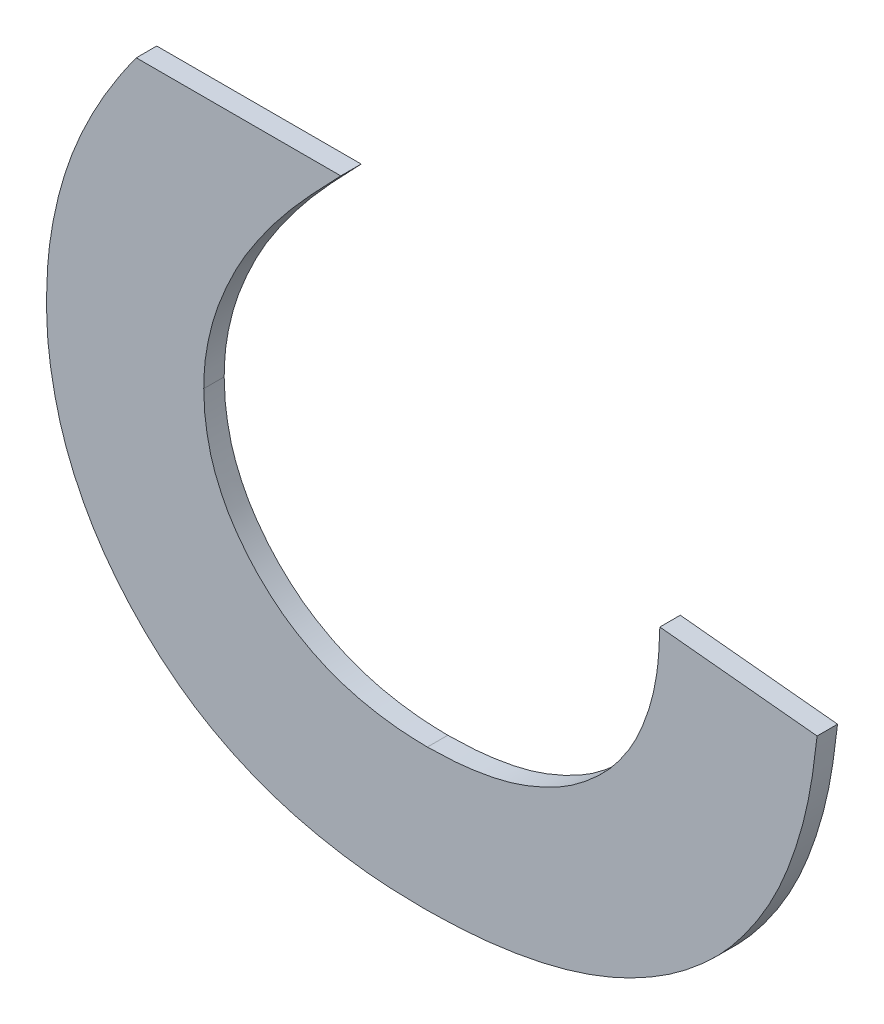
ISO-10303-21;
HEADER;
FILE_DESCRIPTION(('STEP AP214'),'2;1');
FILE_NAME('part.step','',(''),(''),'','','');
FILE_SCHEMA(('AUTOMOTIVE_DESIGN { 1 0 10303 214 1 1 1 1 }'));
ENDSEC;
DATA;
#1=APPLICATION_CONTEXT('core data for automotive mechanical design processes');
#2=APPLICATION_PROTOCOL_DEFINITION('international standard','automotive_design',2000,#1);
#3=PRODUCT_CONTEXT('',#1,'mechanical');
#4=PRODUCT('Part','Part','',(#3));
#5=PRODUCT_RELATED_PRODUCT_CATEGORY('part','',(#4));
#6=PRODUCT_DEFINITION_FORMATION('','',#4);
#7=PRODUCT_DEFINITION_CONTEXT('part definition',#1,'design');
#8=PRODUCT_DEFINITION('design','',#6,#7);
#9=PRODUCT_DEFINITION_SHAPE('','',#8);
#10=(LENGTH_UNIT() NAMED_UNIT(*) SI_UNIT(.MILLI.,.METRE.));
#11=(NAMED_UNIT(*) PLANE_ANGLE_UNIT() SI_UNIT($,.RADIAN.));
#12=(NAMED_UNIT(*) SI_UNIT($,.STERADIAN.) SOLID_ANGLE_UNIT());
#13=UNCERTAINTY_MEASURE_WITH_UNIT(LENGTH_MEASURE(1.E-05),#10,'distance_accuracy_value','');
#14=(GEOMETRIC_REPRESENTATION_CONTEXT(3) GLOBAL_UNCERTAINTY_ASSIGNED_CONTEXT((#13)) GLOBAL_UNIT_ASSIGNED_CONTEXT((#10,
#11,#12)) REPRESENTATION_CONTEXT('',''));
#15=CARTESIAN_POINT('',(0.,0.,0.));
#16=DIRECTION('',(0.,0.,1.));
#17=DIRECTION('',(1.,0.,0.));
#18=AXIS2_PLACEMENT_3D('',#15,#16,#17);
#19=CARTESIAN_POINT('',(0.384615384614354,-15.,0.5));
#20=CARTESIAN_POINT('',(0.0377099923203697,-14.9940575811924,0.5));
#21=CARTESIAN_POINT('',(-0.638063755181499,-14.9824817143538,0.5));
#22=CARTESIAN_POINT('',(-1.62279290019803,-14.8641061896539,0.5));
#23=CARTESIAN_POINT('',(-2.55184417902887,-14.6795931344762,0.5));
#24=CARTESIAN_POINT('',(-3.42893590532352,-14.4229332630746,0.5));
#25=CARTESIAN_POINT('',(-4.24940902985222,-14.083966549589,0.5));
#26=CARTESIAN_POINT('',(-5.01606953500129,-13.6757110311212,0.5));
#27=CARTESIAN_POINT('',(-5.72650139366369,-13.1911539647884,0.5));
#28=CARTESIAN_POINT('',(-6.37101761670645,-12.6323956716173,0.5));
#29=CARTESIAN_POINT('',(-6.95235611217082,-12.0221972437031,0.5));
#30=CARTESIAN_POINT('',(-7.46063357913813,-11.3704699091198,0.5));
#31=CARTESIAN_POINT('',(-7.89045869700782,-10.6818974458787,0.5));
#32=CARTESIAN_POINT('',(-8.23921152866284,-9.95800141103973,0.5));
#33=CARTESIAN_POINT('',(-8.51448917012395,-9.19941421301716,0.5));
#34=CARTESIAN_POINT('',(-8.70121922472878,-8.40443010163868,0.5));
#35=CARTESIAN_POINT('',(-8.83023093254306,-7.57430332658602,0.5));
#36=CARTESIAN_POINT('',(-8.8407756459225,-7.00772582515545,0.5));
#37=CARTESIAN_POINT('',(-8.84615384615488,-6.71875,0.5));
#38=B_SPLINE_CURVE_WITH_KNOTS('',3,(#19,#20,#21,#22,#23,#24,#25,#26,#27,#28,#29,#30,#31,#32,#33,
#34,#35,#36,#37),.UNSPECIFIED.,.F.,.F.,(4,1,1,1,1,1,1,1,1,1,1,1,1,1,1,1,4),(0.,
0.0746990601627185,0.145514209183145,0.213302420909138,0.278567227460936,0.342035449705525,
0.404200807806776,0.465363579233685,0.52686639946622,0.587607564346274,0.646649545103447,
0.704604443573224,0.76211908002101,0.819448870100961,0.878060343861484,0.937806191275107,1.),.UNSPECIFIED.);
#39=DIRECTION('',(0.,0.,1.));
#40=VECTOR('',#39,1.);
#41=SURFACE_OF_LINEAR_EXTRUSION('',#38,#40);
#42=CARTESIAN_POINT('',(0.384615384614354,-15.,1.));
#43=CARTESIAN_POINT('',(0.0377099923203697,-14.9940575811924,1.));
#44=CARTESIAN_POINT('',(-0.638063755181499,-14.9824817143538,1.));
#45=CARTESIAN_POINT('',(-1.62279290019803,-14.8641061896539,1.));
#46=CARTESIAN_POINT('',(-2.55184417902887,-14.6795931344762,1.));
#47=CARTESIAN_POINT('',(-3.42893590532352,-14.4229332630746,1.));
#48=CARTESIAN_POINT('',(-4.24940902985222,-14.083966549589,1.));
#49=CARTESIAN_POINT('',(-5.01606953500129,-13.6757110311212,1.));
#50=CARTESIAN_POINT('',(-5.72650139366369,-13.1911539647884,1.));
#51=CARTESIAN_POINT('',(-6.37101761670645,-12.6323956716173,1.));
#52=CARTESIAN_POINT('',(-6.95235611217082,-12.0221972437031,1.));
#53=CARTESIAN_POINT('',(-7.46063357913813,-11.3704699091198,1.));
#54=CARTESIAN_POINT('',(-7.89045869700782,-10.6818974458787,1.));
#55=CARTESIAN_POINT('',(-8.23921152866284,-9.95800141103973,1.));
#56=CARTESIAN_POINT('',(-8.51448917012395,-9.19941421301716,1.));
#57=CARTESIAN_POINT('',(-8.70121922472878,-8.40443010163868,1.));
#58=CARTESIAN_POINT('',(-8.83023093254306,-7.57430332658602,1.));
#59=CARTESIAN_POINT('',(-8.8407756459225,-7.00772582515545,1.));
#60=CARTESIAN_POINT('',(-8.84615384615488,-6.71875,1.));
#61=B_SPLINE_CURVE_WITH_KNOTS('',3,(#42,#43,#44,#45,#46,#47,#48,#49,#50,#51,#52,#53,#54,#55,#56,
#57,#58,#59,#60),.UNSPECIFIED.,.F.,.F.,(4,1,1,1,1,1,1,1,1,1,1,1,1,1,1,1,4),(0.,
0.0746990601627185,0.145514209183145,0.213302420909138,0.278567227460936,0.342035449705525,
0.404200807806776,0.465363579233685,0.52686639946622,0.587607564346274,0.646649545103447,
0.704604443573224,0.76211908002101,0.819448870100961,0.878060343861484,0.937806191275107,1.),.UNSPECIFIED.);
#62=CARTESIAN_POINT('',(0.384615384614354,-15.,1.));
#63=VERTEX_POINT('',#62);
#64=CARTESIAN_POINT('',(-8.84615384615488,-6.71875,1.));
#65=VERTEX_POINT('',#64);
#66=EDGE_CURVE('E95',#63,#65,#61,.T.);
#67=ORIENTED_EDGE('',*,*,#66,.T.);
#68=DIRECTION('',(0.,0.,1.));
#69=VECTOR('',#68,1.);
#70=CARTESIAN_POINT('',(-8.84615384615488,-6.71875,0.5));
#71=LINE('',#70,#69);
#72=CARTESIAN_POINT('',(-8.84615384615488,-6.71875,0.5));
#73=VERTEX_POINT('',#72);
#74=EDGE_CURVE('E201',#73,#65,#71,.T.);
#75=ORIENTED_EDGE('',*,*,#74,.F.);
#76=CARTESIAN_POINT('',(0.384615384614354,-15.,0.5));
#77=VERTEX_POINT('',#76);
#78=EDGE_CURVE('E63',#77,#73,#38,.T.);
#79=ORIENTED_EDGE('',*,*,#78,.F.);
#80=DIRECTION('',(0.,0.,1.));
#81=VECTOR('',#80,1.);
#82=CARTESIAN_POINT('',(0.384615384614354,-15.,0.5));
#83=LINE('',#82,#81);
#84=EDGE_CURVE('E129',#77,#63,#83,.T.);
#85=ORIENTED_EDGE('',*,*,#84,.T.);
#86=EDGE_LOOP('',(#67,#75,#79,#85));
#87=FACE_BOUND('',#86,.T.);
#88=ADVANCED_FACE('F39',(#87),#41,.F.);
#89=CARTESIAN_POINT('',(9.99999999999897,-6.53846153846153,0.5));
#90=CARTESIAN_POINT('',(9.9606531223146,-6.87366666840529,0.5));
#91=CARTESIAN_POINT('',(9.88410715849025,-7.52577939654185,0.5));
#92=CARTESIAN_POINT('',(9.69335328704841,-8.47019798415294,0.5));
#93=CARTESIAN_POINT('',(9.42587604861149,-9.34898964498448,0.5));
#94=CARTESIAN_POINT('',(9.10472020560015,-10.1734299417282,0.5));
#95=CARTESIAN_POINT('',(8.70555868574364,-10.9339168637297,0.5));
#96=CARTESIAN_POINT('',(8.2401623736781,-11.632770632999,0.5));
#97=CARTESIAN_POINT('',(7.71747521493515,-12.2780099671338,0.5));
#98=CARTESIAN_POINT('',(7.11838539032061,-12.8459189293064,0.5));
#99=CARTESIAN_POINT('',(6.46617765777263,-13.356498648467,0.5));
#100=CARTESIAN_POINT('',(5.75439663858905,-13.7929185063039,0.5));
#101=CARTESIAN_POINT('',(4.99092026255268,-14.1697671525304,0.5));
#102=CARTESIAN_POINT('',(4.17339618076206,-14.4749707596549,0.5));
#103=CARTESIAN_POINT('',(3.30158648148104,-14.7086947396734,0.5));
#104=CARTESIAN_POINT('',(2.37700536496708,-14.8758437040908,0.5));
#105=CARTESIAN_POINT('',(1.39856215501955,-14.9789919083148,0.5));
#106=CARTESIAN_POINT('',(0.727420084521651,-14.9928973859615,0.5));
#107=CARTESIAN_POINT('',(0.384615384614354,-15.,0.5));
#108=B_SPLINE_CURVE_WITH_KNOTS('',3,(#89,#90,#91,#92,#93,#94,#95,#96,#97,#98,#99,#100,#101,#102,
#103,#104,#105,#106,#107),.UNSPECIFIED.,.F.,.F.,(4,1,1,1,1,1,1,1,1,1,1,1,1,1,1,1,4),(0.,
0.0706767817247823,0.13749559547073,0.201477077226668,0.262874869329738,0.322556893578126,
0.380976286457824,0.438515087155202,0.496086006375959,0.553494619961452,0.611714772909301,
0.670636788125626,0.731581283871167,0.79417885027081,0.859442145684026,0.928206120303776,1.),.UNSPECIFIED.);
#109=DIRECTION('',(0.,0.,1.));
#110=VECTOR('',#109,1.);
#111=SURFACE_OF_LINEAR_EXTRUSION('',#108,#110);
#112=CARTESIAN_POINT('',(9.99999999999897,-6.53846153846153,1.));
#113=CARTESIAN_POINT('',(9.9606531223146,-6.87366666840529,1.));
#114=CARTESIAN_POINT('',(9.88410715849025,-7.52577939654185,1.));
#115=CARTESIAN_POINT('',(9.69335328704841,-8.47019798415294,1.));
#116=CARTESIAN_POINT('',(9.42587604861149,-9.34898964498448,1.));
#117=CARTESIAN_POINT('',(9.10472020560015,-10.1734299417282,1.));
#118=CARTESIAN_POINT('',(8.70555868574364,-10.9339168637297,1.));
#119=CARTESIAN_POINT('',(8.2401623736781,-11.632770632999,1.));
#120=CARTESIAN_POINT('',(7.71747521493515,-12.2780099671338,1.));
#121=CARTESIAN_POINT('',(7.11838539032061,-12.8459189293064,1.));
#122=CARTESIAN_POINT('',(6.46617765777263,-13.356498648467,1.));
#123=CARTESIAN_POINT('',(5.75439663858905,-13.7929185063039,1.));
#124=CARTESIAN_POINT('',(4.99092026255268,-14.1697671525304,1.));
#125=CARTESIAN_POINT('',(4.17339618076206,-14.4749707596549,1.));
#126=CARTESIAN_POINT('',(3.30158648148104,-14.7086947396734,1.));
#127=CARTESIAN_POINT('',(2.37700536496708,-14.8758437040908,1.));
#128=CARTESIAN_POINT('',(1.39856215501955,-14.9789919083148,1.));
#129=CARTESIAN_POINT('',(0.727420084521651,-14.9928973859615,1.));
#130=CARTESIAN_POINT('',(0.384615384614354,-15.,1.));
#131=B_SPLINE_CURVE_WITH_KNOTS('',3,(#112,#113,#114,#115,#116,#117,#118,#119,#120,#121,#122,
#123,#124,#125,#126,#127,#128,#129,#130),.UNSPECIFIED.,.F.,.F.,(4,1,1,1,1,1,1,1,1,1,1,1,1,1,1,1,
4),(0.,0.0706767817247823,0.13749559547073,0.201477077226668,0.262874869329738,
0.322556893578126,0.380976286457824,0.438515087155202,0.496086006375959,0.553494619961452,
0.611714772909301,0.670636788125626,0.731581283871167,0.79417885027081,0.859442145684026,
0.928206120303776,1.),.UNSPECIFIED.);
#132=CARTESIAN_POINT('',(9.99999999999897,-6.53846153846153,1.));
#133=VERTEX_POINT('',#132);
#134=EDGE_CURVE('E214',#133,#63,#131,.T.);
#135=ORIENTED_EDGE('',*,*,#134,.T.);
#136=ORIENTED_EDGE('',*,*,#84,.F.);
#137=CARTESIAN_POINT('',(9.99999999999897,-6.53846153846153,0.5));
#138=VERTEX_POINT('',#137);
#139=EDGE_CURVE('E111',#138,#77,#108,.T.);
#140=ORIENTED_EDGE('',*,*,#139,.F.);
#141=DIRECTION('',(0.,0.,1.));
#142=VECTOR('',#141,1.);
#143=CARTESIAN_POINT('',(9.99999999999897,-6.53846153846153,0.5));
#144=LINE('',#143,#142);
#145=EDGE_CURVE('E122',#138,#133,#144,.T.);
#146=ORIENTED_EDGE('',*,*,#145,.T.);
#147=EDGE_LOOP('',(#135,#136,#140,#146));
#148=FACE_BOUND('',#147,.T.);
#149=ADVANCED_FACE('F131',(#148),#111,.F.);
#150=CARTESIAN_POINT('',(6.15384615384512,-6.15384615384615,0.5));
#151=DIRECTION('',(-0.0995037190209984,-0.995037190209989,0.));
#152=DIRECTION('',(0.995037190209989,-0.0995037190209984,0.));
#153=AXIS2_PLACEMENT_3D('',#150,#151,#152);
#154=PLANE('',#153);
#155=DIRECTION('',(0.995037190209989,-0.0995037190209984,0.));
#156=VECTOR('',#155,1.);
#157=CARTESIAN_POINT('',(6.15384615384512,-6.15384615384615,1.));
#158=LINE('',#157,#156);
#159=CARTESIAN_POINT('',(6.15384615384512,-6.15384615384615,1.));
#160=VERTEX_POINT('',#159);
#161=EDGE_CURVE('E124',#160,#133,#158,.T.);
#162=ORIENTED_EDGE('',*,*,#161,.T.);
#163=ORIENTED_EDGE('',*,*,#145,.F.);
#164=DIRECTION('',(0.995037190209989,-0.0995037190209984,0.));
#165=VECTOR('',#164,1.);
#166=CARTESIAN_POINT('',(6.15384615384512,-6.15384615384615,0.5));
#167=LINE('',#166,#165);
#168=CARTESIAN_POINT('',(6.15384615384512,-6.15384615384615,0.5));
#169=VERTEX_POINT('',#168);
#170=EDGE_CURVE('E106',#169,#138,#167,.T.);
#171=ORIENTED_EDGE('',*,*,#170,.F.);
#172=DIRECTION('',(0.,0.,1.));
#173=VECTOR('',#172,1.);
#174=CARTESIAN_POINT('',(6.15384615384512,-6.15384615384615,0.5));
#175=LINE('',#174,#173);
#176=EDGE_CURVE('E126',#169,#160,#175,.T.);
#177=ORIENTED_EDGE('',*,*,#176,.T.);
#178=EDGE_LOOP('',(#162,#163,#171,#177));
#179=FACE_BOUND('',#178,.T.);
#180=ADVANCED_FACE('F121',(#179),#154,.F.);
#181=CARTESIAN_POINT('',(0.468749999998968,-11.5384615384615,0.5));
#182=CARTESIAN_POINT('',(0.677274544310018,-11.5336603906601,0.5));
#183=CARTESIAN_POINT('',(1.08537240145137,-11.5242641915888,0.5));
#184=CARTESIAN_POINT('',(1.681997517647,-11.456209318274,0.5));
#185=CARTESIAN_POINT('',(2.24803156178736,-11.3513662812996,0.5));
#186=CARTESIAN_POINT('',(2.78198636072369,-11.1946657306854,0.5));
#187=CARTESIAN_POINT('',(3.28004385609177,-10.9868231443911,0.5));
#188=CARTESIAN_POINT('',(3.75352850677287,-10.7499531539193,0.5));
#189=CARTESIAN_POINT('',(4.18986887918957,-10.4573496219582,0.5));
#190=CARTESIAN_POINT('',(4.58957400719753,-10.1200275486948,0.5));
#191=CARTESIAN_POINT('',(4.95954575386957,-9.75182787501361,0.5));
#192=CARTESIAN_POINT('',(5.27187169797974,-9.33558576426215,0.5));
#193=CARTESIAN_POINT('',(5.54699450538078,-8.89207750793756,0.5));
#194=CARTESIAN_POINT('',(5.75931642131433,-8.40599984356216,0.5));
#195=CARTESIAN_POINT('',(5.93684491213576,-7.89254587961411,0.5));
#196=CARTESIAN_POINT('',(6.06339123334365,-7.34290478555274,0.5));
#197=CARTESIAN_POINT('',(6.13282617100428,-6.7585653684943,0.5));
#198=CARTESIAN_POINT('',(6.14673779765643,-6.35834487320356,0.5));
#199=CARTESIAN_POINT('',(6.15384615384512,-6.15384615384615,0.5));
#200=B_SPLINE_CURVE_WITH_KNOTS('',3,(#181,#182,#183,#184,#185,#186,#187,#188,#189,#190,#191,
#192,#193,#194,#195,#196,#197,#198,#199),.UNSPECIFIED.,.F.,.F.,(4,1,1,1,1,1,1,1,1,1,1,1,1,1,1,1,
4),(0.,0.070687998210276,0.13834160717404,0.203345459401484,0.265668323470064,0.326587550158278,
0.386124288092698,0.4448968030792,0.504204530317891,0.563278454830756,0.621419667782722,
0.680243178453427,0.739826387115308,0.80082507123057,0.864255755827822,0.930639423967569,1.),.UNSPECIFIED.);
#201=DIRECTION('',(0.,0.,1.));
#202=VECTOR('',#201,1.);
#203=SURFACE_OF_LINEAR_EXTRUSION('',#200,#202);
#204=CARTESIAN_POINT('',(0.468749999998968,-11.5384615384615,1.));
#205=CARTESIAN_POINT('',(0.677274544310018,-11.5336603906601,1.));
#206=CARTESIAN_POINT('',(1.08537240145137,-11.5242641915888,1.));
#207=CARTESIAN_POINT('',(1.681997517647,-11.456209318274,1.));
#208=CARTESIAN_POINT('',(2.24803156178736,-11.3513662812996,1.));
#209=CARTESIAN_POINT('',(2.78198636072369,-11.1946657306854,1.));
#210=CARTESIAN_POINT('',(3.28004385609177,-10.9868231443911,1.));
#211=CARTESIAN_POINT('',(3.75352850677287,-10.7499531539193,1.));
#212=CARTESIAN_POINT('',(4.18986887918957,-10.4573496219582,1.));
#213=CARTESIAN_POINT('',(4.58957400719753,-10.1200275486948,1.));
#214=CARTESIAN_POINT('',(4.95954575386957,-9.75182787501361,1.));
#215=CARTESIAN_POINT('',(5.27187169797974,-9.33558576426215,1.));
#216=CARTESIAN_POINT('',(5.54699450538078,-8.89207750793756,1.));
#217=CARTESIAN_POINT('',(5.75931642131433,-8.40599984356216,1.));
#218=CARTESIAN_POINT('',(5.93684491213576,-7.89254587961411,1.));
#219=CARTESIAN_POINT('',(6.06339123334365,-7.34290478555274,1.));
#220=CARTESIAN_POINT('',(6.13282617100428,-6.7585653684943,1.));
#221=CARTESIAN_POINT('',(6.14673779765643,-6.35834487320356,1.));
#222=CARTESIAN_POINT('',(6.15384615384512,-6.15384615384615,1.));
#223=B_SPLINE_CURVE_WITH_KNOTS('',3,(#204,#205,#206,#207,#208,#209,#210,#211,#212,#213,#214,
#215,#216,#217,#218,#219,#220,#221,#222),.UNSPECIFIED.,.F.,.F.,(4,1,1,1,1,1,1,1,1,1,1,1,1,1,1,1,
4),(0.,0.070687998210276,0.13834160717404,0.203345459401484,0.265668323470064,0.326587550158278,
0.386124288092698,0.4448968030792,0.504204530317891,0.563278454830756,0.621419667782722,
0.680243178453427,0.739826387115308,0.80082507123057,0.864255755827822,0.930639423967569,1.),.UNSPECIFIED.);
#224=CARTESIAN_POINT('',(0.468749999998968,-11.5384615384615,1.));
#225=VERTEX_POINT('',#224);
#226=EDGE_CURVE('E196',#225,#160,#223,.T.);
#227=ORIENTED_EDGE('',*,*,#226,.T.);
#228=ORIENTED_EDGE('',*,*,#176,.F.);
#229=CARTESIAN_POINT('',(0.468749999998968,-11.5384615384615,0.5));
#230=VERTEX_POINT('',#229);
#231=EDGE_CURVE('E117',#230,#169,#200,.T.);
#232=ORIENTED_EDGE('',*,*,#231,.F.);
#233=DIRECTION('',(0.,0.,1.));
#234=VECTOR('',#233,1.);
#235=CARTESIAN_POINT('',(0.468749999998968,-11.5384615384615,0.5));
#236=LINE('',#235,#234);
#237=EDGE_CURVE('E191',#230,#225,#236,.T.);
#238=ORIENTED_EDGE('',*,*,#237,.T.);
#239=EDGE_LOOP('',(#227,#228,#232,#238));
#240=FACE_BOUND('',#239,.T.);
#241=ADVANCED_FACE('F155',(#240),#203,.F.);
#242=CARTESIAN_POINT('',(-5.00000000000103,-6.68269230769231,0.5));
#243=CARTESIAN_POINT('',(-4.99582449105417,-6.85129465499825,0.5));
#244=CARTESIAN_POINT('',(-4.98763236958483,-7.18208329099997,0.5));
#245=CARTESIAN_POINT('',(-4.90988978219264,-7.66618368219245,0.5));
#246=CARTESIAN_POINT('',(-4.80170129301121,-8.13240983725261,0.5));
#247=CARTESIAN_POINT('',(-4.62665747476758,-8.57224694930745,0.5));
#248=CARTESIAN_POINT('',(-4.41876954194618,-8.99917721717018,0.5));
#249=CARTESIAN_POINT('',(-4.14941442600319,-9.39928908136599,0.5));
#250=CARTESIAN_POINT('',(-3.84452652281138,-9.78770738474634,0.5));
#251=CARTESIAN_POINT('',(-3.48834372447023,-10.1440891801716,0.5));
#252=CARTESIAN_POINT('',(-3.10201949366179,-10.4780914042811,0.5));
#253=CARTESIAN_POINT('',(-2.67202165526954,-10.7571949576634,0.5));
#254=CARTESIAN_POINT('',(-2.21856517012899,-11.0007504350331,0.5));
#255=CARTESIAN_POINT('',(-1.73771318359313,-11.1992679769149,0.5));
#256=CARTESIAN_POINT('',(-1.22584791928441,-11.3502784661734,0.5));
#257=CARTESIAN_POINT('',(-0.686567618552671,-11.456062625859,0.5));
#258=CARTESIAN_POINT('',(-0.117905563004937,-11.5242979497859,0.5));
#259=CARTESIAN_POINT('',(0.270233276738403,-11.5336687615907,0.5));
#260=CARTESIAN_POINT('',(0.468749999998968,-11.5384615384615,0.5));
#261=B_SPLINE_CURVE_WITH_KNOTS('',3,(#242,#243,#244,#245,#246,#247,#248,#249,#250,#251,#252,
#253,#254,#255,#256,#257,#258,#259,#260),.UNSPECIFIED.,.F.,.F.,(4,1,1,1,1,1,1,1,1,1,1,1,1,1,1,1,
4),(0.,0.0617499482833056,0.121150040270477,0.179385940714247,0.236796617964866,
0.294263617018352,0.353121147770017,0.413211620646579,0.475000848683269,0.537523080949876,
0.600045313216484,0.662459655441933,0.726004070679534,0.790357894134783,0.857752424497621,
0.927246336390439,1.),.UNSPECIFIED.);
#262=DIRECTION('',(0.,0.,1.));
#263=VECTOR('',#262,1.);
#264=SURFACE_OF_LINEAR_EXTRUSION('',#261,#263);
#265=CARTESIAN_POINT('',(-5.00000000000103,-6.68269230769231,1.));
#266=CARTESIAN_POINT('',(-4.99582449105417,-6.85129465499825,1.));
#267=CARTESIAN_POINT('',(-4.98763236958483,-7.18208329099997,1.));
#268=CARTESIAN_POINT('',(-4.90988978219264,-7.66618368219245,1.));
#269=CARTESIAN_POINT('',(-4.80170129301121,-8.13240983725261,1.));
#270=CARTESIAN_POINT('',(-4.62665747476758,-8.57224694930745,1.));
#271=CARTESIAN_POINT('',(-4.41876954194618,-8.99917721717018,1.));
#272=CARTESIAN_POINT('',(-4.14941442600319,-9.39928908136599,1.));
#273=CARTESIAN_POINT('',(-3.84452652281138,-9.78770738474634,1.));
#274=CARTESIAN_POINT('',(-3.48834372447023,-10.1440891801716,1.));
#275=CARTESIAN_POINT('',(-3.10201949366179,-10.4780914042811,1.));
#276=CARTESIAN_POINT('',(-2.67202165526954,-10.7571949576634,1.));
#277=CARTESIAN_POINT('',(-2.21856517012899,-11.0007504350331,1.));
#278=CARTESIAN_POINT('',(-1.73771318359313,-11.1992679769149,1.));
#279=CARTESIAN_POINT('',(-1.22584791928441,-11.3502784661734,1.));
#280=CARTESIAN_POINT('',(-0.686567618552671,-11.456062625859,1.));
#281=CARTESIAN_POINT('',(-0.117905563004937,-11.5242979497859,1.));
#282=CARTESIAN_POINT('',(0.270233276738403,-11.5336687615907,1.));
#283=CARTESIAN_POINT('',(0.468749999998968,-11.5384615384615,1.));
#284=B_SPLINE_CURVE_WITH_KNOTS('',3,(#265,#266,#267,#268,#269,#270,#271,#272,#273,#274,#275,
#276,#277,#278,#279,#280,#281,#282,#283),.UNSPECIFIED.,.F.,.F.,(4,1,1,1,1,1,1,1,1,1,1,1,1,1,1,1,
4),(0.,0.0617499482833056,0.121150040270477,0.179385940714247,0.236796617964866,
0.294263617018352,0.353121147770017,0.413211620646579,0.475000848683269,0.537523080949876,
0.600045313216484,0.662459655441933,0.726004070679534,0.790357894134783,0.857752424497621,
0.927246336390439,1.),.UNSPECIFIED.);
#285=CARTESIAN_POINT('',(-5.00000000000103,-6.68269230769231,1.));
#286=VERTEX_POINT('',#285);
#287=EDGE_CURVE('E199',#286,#225,#284,.T.);
#288=ORIENTED_EDGE('',*,*,#287,.T.);
#289=ORIENTED_EDGE('',*,*,#237,.F.);
#290=CARTESIAN_POINT('',(-5.00000000000103,-6.68269230769231,0.5));
#291=VERTEX_POINT('',#290);
#292=EDGE_CURVE('E162',#291,#230,#261,.T.);
#293=ORIENTED_EDGE('',*,*,#292,.F.);
#294=DIRECTION('',(0.,0.,1.));
#295=VECTOR('',#294,1.);
#296=CARTESIAN_POINT('',(-5.00000000000103,-6.68269230769231,0.5));
#297=LINE('',#296,#295);
#298=EDGE_CURVE('E42',#291,#286,#297,.T.);
#299=ORIENTED_EDGE('',*,*,#298,.T.);
#300=EDGE_LOOP('',(#288,#289,#293,#299));
#301=FACE_BOUND('',#300,.T.);
#302=ADVANCED_FACE('F153',(#301),#264,.F.);
#303=CARTESIAN_POINT('',(10.3013707252246,13.6478718313549,0.5));
#304=DIRECTION('',(0.,0.,1.));
#305=DIRECTION('',(1.,0.,0.));
#306=AXIS2_PLACEMENT_3D('',#303,#304,#305);
#307=PLANE('',#306);
#308=CARTESIAN_POINT('',(-8.84615384615488,-6.71875,0.5));
#309=CARTESIAN_POINT('',(-8.83806249776335,-6.42183244735441,0.5));
#310=CARTESIAN_POINT('',(-8.82186194474833,-5.82734209544152,0.5));
#311=CARTESIAN_POINT('',(-8.69003244603747,-4.94001165257285,0.5));
#312=CARTESIAN_POINT('',(-8.47992216084123,-4.06094458881379,0.5));
#313=CARTESIAN_POINT('',(-8.18190967304258,-3.1820593800397,0.5));
#314=CARTESIAN_POINT('',(-7.777931242362,-2.29865637616619,0.5));
#315=CARTESIAN_POINT('',(-7.27182992419509,-1.3945848947632,0.5));
#316=CARTESIAN_POINT('',(-6.64517719539336,-0.476049810792782,0.5));
#317=CARTESIAN_POINT('',(-6.04454419221026,0.305787528845954,0.5));
#318=CARTESIAN_POINT('',(-5.48466470499987,0.960342195277086,0.5));
#319=CARTESIAN_POINT('',(-4.98424614306112,1.50029847124342,0.5));
#320=CARTESIAN_POINT('',(-4.41239438365815,2.08270044977777,0.5));
#321=CARTESIAN_POINT('',(-3.77094125638016,2.70561310300867,0.5));
#322=CARTESIAN_POINT('',(-3.05682436482722,3.36766161487766,0.5));
#323=CARTESIAN_POINT('',(-2.27930062646874,4.07711761076674,0.5));
#324=CARTESIAN_POINT('',(-1.42375874270697,4.81976701796532,0.5));
#325=CARTESIAN_POINT('',(-0.82969457434853,5.32695784605326,0.5));
#326=CARTESIAN_POINT('',(-0.52283653846257,5.58894230769231,0.5));
#327=B_SPLINE_CURVE_WITH_KNOTS('',3,(#308,#309,#310,#311,#312,#313,#314,#315,#316,#317,#318,
#319,#320,#321,#322,#323,#324,#325,#326),.UNSPECIFIED.,.F.,.F.,(4,1,1,1,1,1,1,1,1,1,1,1,1,1,1,1,
4),(0.,0.0579411468644318,0.116010160001513,0.17472214152384,0.234205252182943,
0.296862310384137,0.364092289671109,0.436218736314293,0.513732917348809,0.556445946326714,
0.604322896592817,0.657417446075985,0.715768875352228,0.778854030234387,0.847511002364808,
0.921233299699165,1.),.UNSPECIFIED.);
#328=CARTESIAN_POINT('',(-6.64916816513386,-0.5,0.499999999999696));
#329=VERTEX_POINT('',#328);
#330=EDGE_CURVE('E133',#73,#329,#327,.T.);
#331=ORIENTED_EDGE('',*,*,#330,.T.);
#332=DIRECTION('',(1.,0.,0.));
#333=VECTOR('',#332,1.);
#334=CARTESIAN_POINT('',(10.3013707252246,-0.5,0.500000000000013));
#335=LINE('',#334,#333);
#336=CARTESIAN_POINT('',(-1.6491250339211,-0.499999999102238,0.5));
#337=VERTEX_POINT('',#336);
#338=EDGE_CURVE('E182',#329,#337,#335,.T.);
#339=ORIENTED_EDGE('',*,*,#338,.T.);
#340=CARTESIAN_POINT('',(3.06490384615282,3.78004807692308,0.5));
#341=CARTESIAN_POINT('',(2.67889070631676,3.45514703156124,0.5));
#342=CARTESIAN_POINT('',(1.93559792030228,2.82952945986775,0.5));
#343=CARTESIAN_POINT('',(0.885951448638293,1.9011713126776,0.5));
#344=CARTESIAN_POINT('',(-0.0727276931636499,1.03913696809529,0.5));
#345=CARTESIAN_POINT('',(-0.925182577812181,0.228322841868356,0.5));
#346=CARTESIAN_POINT('',(-1.6783563296038,-0.523423841582424,0.5));
#347=CARTESIAN_POINT('',(-2.33410988601868,-1.21434520633422,0.5));
#348=CARTESIAN_POINT('',(-2.89779519431719,-1.84245654172919,0.5));
#349=CARTESIAN_POINT('',(-3.36342938404035,-2.42995609244121,0.5));
#350=CARTESIAN_POINT('',(-3.75321093388398,-2.98460009420098,0.5));
#351=CARTESIAN_POINT('',(-4.09162653323076,-3.52262516765213,0.5));
#352=CARTESIAN_POINT('',(-4.3632956534471,-4.06287069758443,0.5));
#353=CARTESIAN_POINT('',(-4.59642858402199,-4.59507700423672,0.5));
#354=CARTESIAN_POINT('',(-4.77729526091397,-5.12134581270695,0.5));
#355=CARTESIAN_POINT('',(-4.90458444370211,-5.64639091588293,0.5));
#356=CARTESIAN_POINT('',(-4.98683854712941,-6.16524214749353,0.5));
#357=CARTESIAN_POINT('',(-4.9956616539444,-6.51212771395807,0.5));
#358=CARTESIAN_POINT('',(-5.00000000000103,-6.68269230769231,0.5));
#359=B_SPLINE_CURVE_WITH_KNOTS('',3,(#340,#341,#342,#343,#344,#345,#346,#347,#348,#349,#350,
#351,#352,#353,#354,#355,#356,#357,#358),.UNSPECIFIED.,.F.,.F.,(4,1,1,1,1,1,1,1,1,1,1,1,1,1,1,1,
4),(0.,0.111406972200585,0.214521191645391,0.309409760521901,0.396077634896816,
0.474272773961809,0.544360748209225,0.606404932481209,0.660565665345591,0.709776693753555,
0.756055534050024,0.800764557878327,0.843164497560526,0.884290085959464,0.923448912493092,
0.962359618263724,1.),.UNSPECIFIED.);
#360=EDGE_CURVE('E98',#337,#291,#359,.T.);
#361=ORIENTED_EDGE('',*,*,#360,.T.);
#362=ORIENTED_EDGE('',*,*,#292,.T.);
#363=ORIENTED_EDGE('',*,*,#231,.T.);
#364=ORIENTED_EDGE('',*,*,#170,.T.);
#365=ORIENTED_EDGE('',*,*,#139,.T.);
#366=ORIENTED_EDGE('',*,*,#78,.T.);
#367=EDGE_LOOP('',(#331,#339,#361,#362,#363,#364,#365,#366));
#368=FACE_BOUND('',#367,.T.);
#369=ADVANCED_FACE('F112',(#368),#307,.F.);
#370=DIRECTION('',(0.,0.,1.));
#371=VECTOR('',#370,1.);
#372=SURFACE_OF_LINEAR_EXTRUSION('',#327,#371);
#373=CARTESIAN_POINT('',(-8.84615384615488,-6.71875,1.));
#374=CARTESIAN_POINT('',(-8.83806249776335,-6.42183244735441,1.));
#375=CARTESIAN_POINT('',(-8.82186194474833,-5.82734209544152,1.));
#376=CARTESIAN_POINT('',(-8.69003244603747,-4.94001165257285,1.));
#377=CARTESIAN_POINT('',(-8.47992216084123,-4.06094458881379,1.));
#378=CARTESIAN_POINT('',(-8.18190967304258,-3.1820593800397,1.));
#379=CARTESIAN_POINT('',(-7.777931242362,-2.29865637616619,1.));
#380=CARTESIAN_POINT('',(-7.27182992419509,-1.3945848947632,1.));
#381=CARTESIAN_POINT('',(-6.64517719539336,-0.476049810792782,1.));
#382=CARTESIAN_POINT('',(-6.04454419221026,0.305787528845954,1.));
#383=CARTESIAN_POINT('',(-5.48466470499987,0.960342195277086,1.));
#384=CARTESIAN_POINT('',(-4.98424614306112,1.50029847124342,1.));
#385=CARTESIAN_POINT('',(-4.41239438365815,2.08270044977777,1.));
#386=CARTESIAN_POINT('',(-3.77094125638016,2.70561310300867,1.));
#387=CARTESIAN_POINT('',(-3.05682436482722,3.36766161487766,1.));
#388=CARTESIAN_POINT('',(-2.27930062646874,4.07711761076674,1.));
#389=CARTESIAN_POINT('',(-1.42375874270697,4.81976701796532,1.));
#390=CARTESIAN_POINT('',(-0.82969457434853,5.32695784605326,1.));
#391=CARTESIAN_POINT('',(-0.52283653846257,5.58894230769231,1.));
#392=B_SPLINE_CURVE_WITH_KNOTS('',3,(#373,#374,#375,#376,#377,#378,#379,#380,#381,#382,#383,
#384,#385,#386,#387,#388,#389,#390,#391),.UNSPECIFIED.,.F.,.F.,(4,1,1,1,1,1,1,1,1,1,1,1,1,1,1,1,
4),(0.,0.0579411468644318,0.116010160001513,0.17472214152384,0.234205252182943,
0.296862310384137,0.364092289671109,0.436218736314293,0.513732917348809,0.556445946326714,
0.604322896592817,0.657417446075985,0.715768875352228,0.778854030234387,0.847511002364808,
0.921233299699165,1.),.UNSPECIFIED.);
#393=CARTESIAN_POINT('',(-6.64916816513386,-0.5,1.));
#394=VERTEX_POINT('',#393);
#395=EDGE_CURVE('E172',#65,#394,#392,.T.);
#396=ORIENTED_EDGE('',*,*,#395,.T.);
#397=DIRECTION('',(0.,0.,1.));
#398=VECTOR('',#397,1.);
#399=CARTESIAN_POINT('',(-6.64916816513571,-0.500000000000001,0.5));
#400=LINE('',#399,#398);
#401=EDGE_CURVE('E181',#394,#329,#400,.F.);
#402=ORIENTED_EDGE('',*,*,#401,.T.);
#403=ORIENTED_EDGE('',*,*,#330,.F.);
#404=ORIENTED_EDGE('',*,*,#74,.T.);
#405=EDGE_LOOP('',(#396,#402,#403,#404));
#406=FACE_BOUND('',#405,.T.);
#407=ADVANCED_FACE('F249',(#406),#372,.F.);
#408=DIRECTION('',(0.,0.,1.));
#409=VECTOR('',#408,1.);
#410=SURFACE_OF_LINEAR_EXTRUSION('',#359,#409);
#411=ORIENTED_EDGE('',*,*,#360,.F.);
#412=DIRECTION('',(0.,0.,1.));
#413=VECTOR('',#412,1.);
#414=CARTESIAN_POINT('',(-1.64912503479871,-0.5,0.5));
#415=LINE('',#414,#413);
#416=CARTESIAN_POINT('',(-1.6491250339211,-0.5,1.));
#417=VERTEX_POINT('',#416);
#418=EDGE_CURVE('E57',#337,#417,#415,.T.);
#419=ORIENTED_EDGE('',*,*,#418,.T.);
#420=CARTESIAN_POINT('',(3.06490384615282,3.78004807692308,1.));
#421=CARTESIAN_POINT('',(2.67889070631676,3.45514703156124,1.));
#422=CARTESIAN_POINT('',(1.93559792030228,2.82952945986775,1.));
#423=CARTESIAN_POINT('',(0.885951448638293,1.9011713126776,1.));
#424=CARTESIAN_POINT('',(-0.0727276931636499,1.03913696809529,1.));
#425=CARTESIAN_POINT('',(-0.925182577812181,0.228322841868356,1.));
#426=CARTESIAN_POINT('',(-1.6783563296038,-0.523423841582424,1.));
#427=CARTESIAN_POINT('',(-2.33410988601868,-1.21434520633422,1.));
#428=CARTESIAN_POINT('',(-2.89779519431719,-1.84245654172919,1.));
#429=CARTESIAN_POINT('',(-3.36342938404035,-2.42995609244121,1.));
#430=CARTESIAN_POINT('',(-3.75321093388398,-2.98460009420098,1.));
#431=CARTESIAN_POINT('',(-4.09162653323076,-3.52262516765213,1.));
#432=CARTESIAN_POINT('',(-4.3632956534471,-4.06287069758443,1.));
#433=CARTESIAN_POINT('',(-4.59642858402199,-4.59507700423672,1.));
#434=CARTESIAN_POINT('',(-4.77729526091397,-5.12134581270695,1.));
#435=CARTESIAN_POINT('',(-4.90458444370211,-5.64639091588293,1.));
#436=CARTESIAN_POINT('',(-4.98683854712941,-6.16524214749353,1.));
#437=CARTESIAN_POINT('',(-4.9956616539444,-6.51212771395807,1.));
#438=CARTESIAN_POINT('',(-5.00000000000103,-6.68269230769231,1.));
#439=B_SPLINE_CURVE_WITH_KNOTS('',3,(#420,#421,#422,#423,#424,#425,#426,#427,#428,#429,#430,
#431,#432,#433,#434,#435,#436,#437,#438),.UNSPECIFIED.,.F.,.F.,(4,1,1,1,1,1,1,1,1,1,1,1,1,1,1,1,
4),(0.,0.111406972200585,0.214521191645391,0.309409760521901,0.396077634896816,
0.474272773961809,0.544360748209225,0.606404932481209,0.660565665345591,0.709776693753555,
0.756055534050024,0.800764557878327,0.843164497560526,0.884290085959464,0.923448912493092,
0.962359618263724,1.),.UNSPECIFIED.);
#440=EDGE_CURVE('E179',#417,#286,#439,.T.);
#441=ORIENTED_EDGE('',*,*,#440,.T.);
#442=ORIENTED_EDGE('',*,*,#298,.F.);
#443=EDGE_LOOP('',(#411,#419,#441,#442));
#444=FACE_BOUND('',#443,.T.);
#445=ADVANCED_FACE('F41',(#444),#410,.F.);
#446=CARTESIAN_POINT('',(10.3013707252246,13.6478718313549,1.));
#447=DIRECTION('',(0.,0.,1.));
#448=DIRECTION('',(1.,0.,0.));
#449=AXIS2_PLACEMENT_3D('',#446,#447,#448);
#450=PLANE('',#449);
#451=ORIENTED_EDGE('',*,*,#440,.F.);
#452=DIRECTION('',(-1.,0.,0.));
#453=VECTOR('',#452,1.);
#454=CARTESIAN_POINT('',(-17.,-0.5,1.));
#455=LINE('',#454,#453);
#456=EDGE_CURVE('E11',#417,#394,#455,.T.);
#457=ORIENTED_EDGE('',*,*,#456,.T.);
#458=ORIENTED_EDGE('',*,*,#395,.F.);
#459=ORIENTED_EDGE('',*,*,#66,.F.);
#460=ORIENTED_EDGE('',*,*,#134,.F.);
#461=ORIENTED_EDGE('',*,*,#161,.F.);
#462=ORIENTED_EDGE('',*,*,#226,.F.);
#463=ORIENTED_EDGE('',*,*,#287,.F.);
#464=EDGE_LOOP('',(#451,#457,#458,#459,#460,#461,#462,#463));
#465=FACE_BOUND('',#464,.T.);
#466=ADVANCED_FACE('F255',(#465),#450,.T.);
#467=CARTESIAN_POINT('',(-17.,-0.5,1.));
#468=DIRECTION('',(0.,-1.,0.));
#469=DIRECTION('',(0.,0.,-1.));
#470=AXIS2_PLACEMENT_3D('',#467,#468,#469);
#471=PLANE('',#470);
#472=ORIENTED_EDGE('',*,*,#338,.F.);
#473=ORIENTED_EDGE('',*,*,#401,.F.);
#474=ORIENTED_EDGE('',*,*,#456,.F.);
#475=ORIENTED_EDGE('',*,*,#418,.F.);
#476=EDGE_LOOP('',(#472,#473,#474,#475));
#477=FACE_BOUND('',#476,.T.);
#478=ADVANCED_FACE('F258',(#477),#471,.F.);
#479=CLOSED_SHELL('',(#88,#149,#180,#241,#302,#369,#407,#445,#466,#478));
#480=MANIFOLD_SOLID_BREP('B2',#479);
#481=ADVANCED_BREP_SHAPE_REPRESENTATION('',(#18,#480),#14);
#482=SHAPE_DEFINITION_REPRESENTATION(#9,#481);
ENDSEC;
END-ISO-10303-21;
